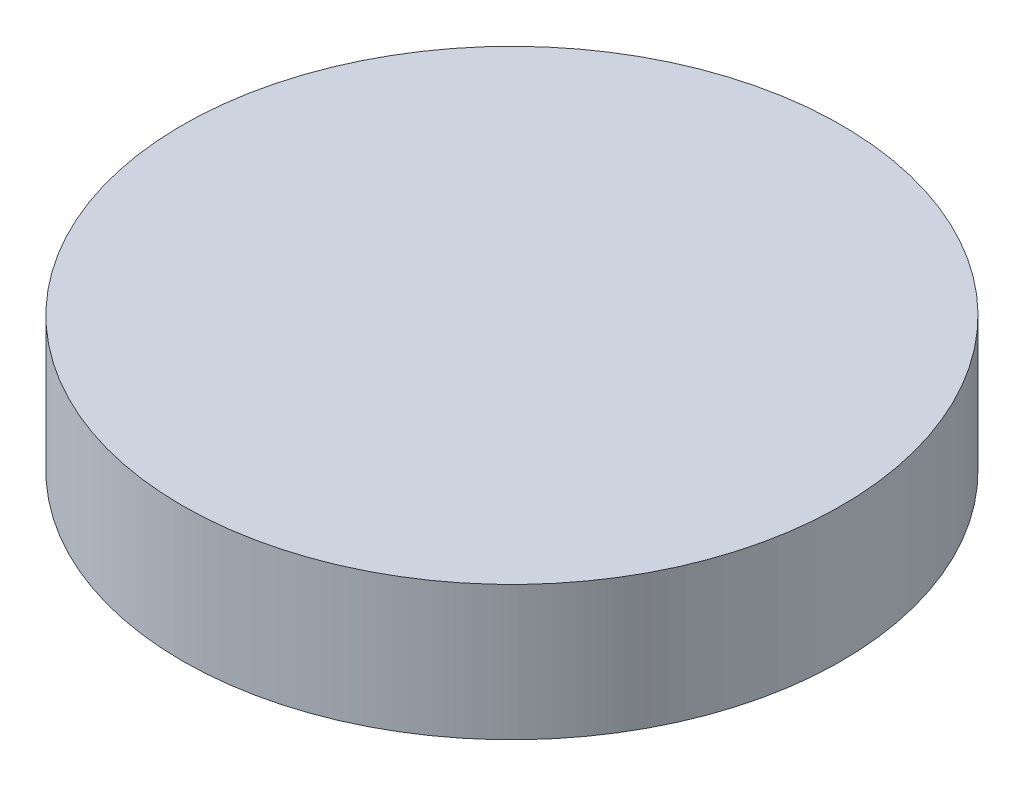
ISO-10303-21;
HEADER;
FILE_DESCRIPTION(('STEP AP214'),'2;1');
FILE_NAME('part.step','',(''),(''),'','','');
FILE_SCHEMA(('AUTOMOTIVE_DESIGN { 1 0 10303 214 1 1 1 1 }'));
ENDSEC;
DATA;
#1=APPLICATION_CONTEXT('core data for automotive mechanical design processes');
#2=APPLICATION_PROTOCOL_DEFINITION('international standard','automotive_design',2000,#1);
#3=PRODUCT_CONTEXT('',#1,'mechanical');
#4=PRODUCT('Part','Part','',(#3));
#5=PRODUCT_RELATED_PRODUCT_CATEGORY('part','',(#4));
#6=PRODUCT_DEFINITION_FORMATION('','',#4);
#7=PRODUCT_DEFINITION_CONTEXT('part definition',#1,'design');
#8=PRODUCT_DEFINITION('design','',#6,#7);
#9=PRODUCT_DEFINITION_SHAPE('','',#8);
#10=(LENGTH_UNIT() NAMED_UNIT(*) SI_UNIT(.MILLI.,.METRE.));
#11=(NAMED_UNIT(*) PLANE_ANGLE_UNIT() SI_UNIT($,.RADIAN.));
#12=(NAMED_UNIT(*) SI_UNIT($,.STERADIAN.) SOLID_ANGLE_UNIT());
#13=UNCERTAINTY_MEASURE_WITH_UNIT(LENGTH_MEASURE(1.E-05),#10,'distance_accuracy_value','');
#14=(GEOMETRIC_REPRESENTATION_CONTEXT(3) GLOBAL_UNCERTAINTY_ASSIGNED_CONTEXT((#13)) GLOBAL_UNIT_ASSIGNED_CONTEXT((#10,
#11,#12)) REPRESENTATION_CONTEXT('',''));
#15=CARTESIAN_POINT('',(0.,0.,0.));
#16=DIRECTION('',(0.,0.,1.));
#17=DIRECTION('',(1.,0.,0.));
#18=AXIS2_PLACEMENT_3D('',#15,#16,#17);
#19=CARTESIAN_POINT('',(0.,5.,0.));
#20=DIRECTION('',(0.,-1.,0.));
#21=DIRECTION('',(0.,0.,-1.));
#22=AXIS2_PLACEMENT_3D('',#19,#20,#21);
#23=CYLINDRICAL_SURFACE('',#22,12.25);
#24=CARTESIAN_POINT('',(0.,5.,0.));
#25=DIRECTION('',(0.,1.,0.));
#26=DIRECTION('',(0.,0.,1.));
#27=AXIS2_PLACEMENT_3D('',#24,#25,#26);
#28=CIRCLE('',#27,12.25);
#29=CARTESIAN_POINT('',(0.,5.,12.25));
#30=VERTEX_POINT('',#29);
#31=EDGE_CURVE('E10',#30,#30,#28,.T.);
#32=ORIENTED_EDGE('',*,*,#31,.F.);
#33=EDGE_LOOP('',(#32));
#34=FACE_BOUND('',#33,.T.);
#35=CARTESIAN_POINT('',(0.,0.,0.));
#36=DIRECTION('',(0.,1.,0.));
#37=DIRECTION('',(0.,0.,1.));
#38=AXIS2_PLACEMENT_3D('',#35,#36,#37);
#39=CIRCLE('',#38,12.25);
#40=CARTESIAN_POINT('',(0.,0.,12.25));
#41=VERTEX_POINT('',#40);
#42=EDGE_CURVE('E44',#41,#41,#39,.T.);
#43=ORIENTED_EDGE('',*,*,#42,.T.);
#44=EDGE_LOOP('',(#43));
#45=FACE_BOUND('',#44,.T.);
#46=ADVANCED_FACE('F41',(#34,#45),#23,.T.);
#47=CARTESIAN_POINT('',(0.,5.,0.));
#48=DIRECTION('',(0.,1.,0.));
#49=DIRECTION('',(0.,0.,1.));
#50=AXIS2_PLACEMENT_3D('',#47,#48,#49);
#51=PLANE('',#50);
#52=ORIENTED_EDGE('',*,*,#31,.T.);
#53=EDGE_LOOP('',(#52));
#54=FACE_BOUND('',#53,.T.);
#55=ADVANCED_FACE('F56',(#54),#51,.T.);
#56=CARTESIAN_POINT('',(0.,0.,0.));
#57=DIRECTION('',(0.,1.,0.));
#58=DIRECTION('',(0.,0.,1.));
#59=AXIS2_PLACEMENT_3D('',#56,#57,#58);
#60=PLANE('',#59);
#61=ORIENTED_EDGE('',*,*,#42,.F.);
#62=EDGE_LOOP('',(#61));
#63=FACE_BOUND('',#62,.T.);
#64=ADVANCED_FACE('F54',(#63),#60,.F.);
#65=CLOSED_SHELL('',(#46,#55,#64));
#66=MANIFOLD_SOLID_BREP('B2',#65);
#67=ADVANCED_BREP_SHAPE_REPRESENTATION('',(#18,#66),#14);
#68=SHAPE_DEFINITION_REPRESENTATION(#9,#67);
ENDSEC;
END-ISO-10303-21;
